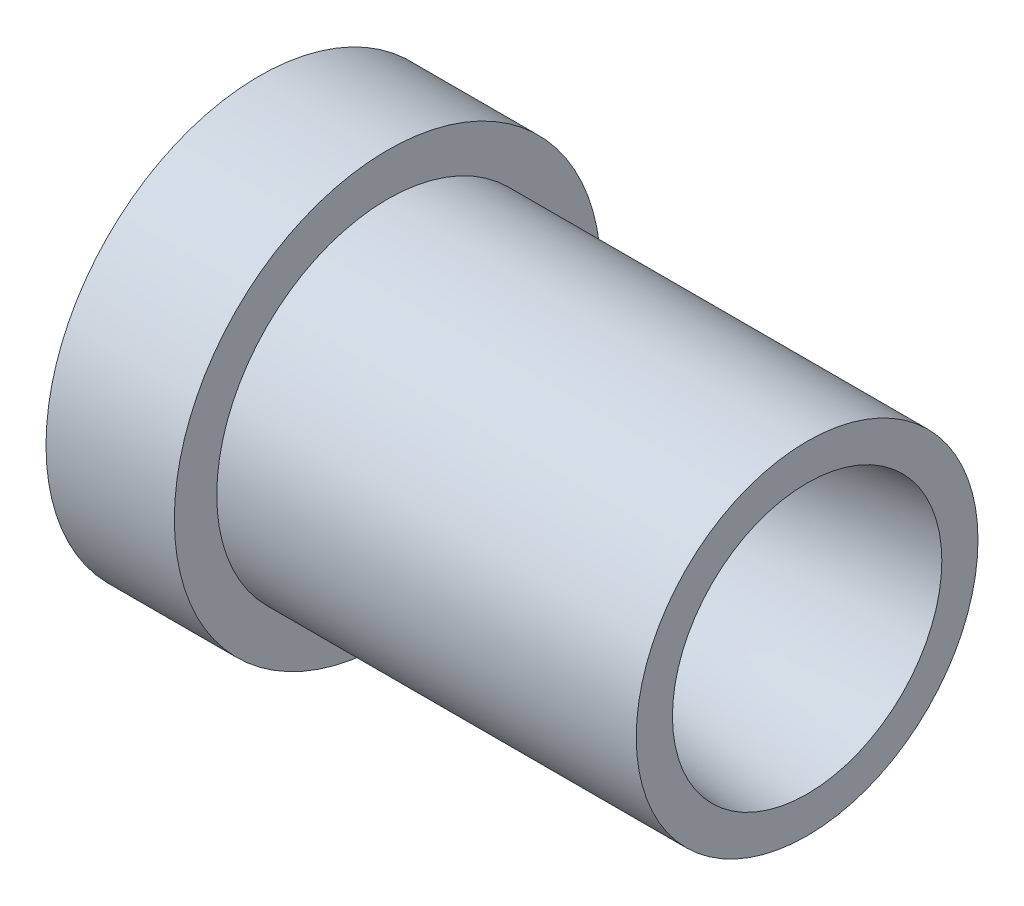
ISO-10303-21;
HEADER;
FILE_DESCRIPTION(('STEP AP214'),'2;1');
FILE_NAME('part.step','',(''),(''),'','','');
FILE_SCHEMA(('AUTOMOTIVE_DESIGN { 1 0 10303 214 1 1 1 1 }'));
ENDSEC;
DATA;
#1=APPLICATION_CONTEXT('core data for automotive mechanical design processes');
#2=APPLICATION_PROTOCOL_DEFINITION('international standard','automotive_design',2000,#1);
#3=PRODUCT_CONTEXT('',#1,'mechanical');
#4=PRODUCT('Part','Part','',(#3));
#5=PRODUCT_RELATED_PRODUCT_CATEGORY('part','',(#4));
#6=PRODUCT_DEFINITION_FORMATION('','',#4);
#7=PRODUCT_DEFINITION_CONTEXT('part definition',#1,'design');
#8=PRODUCT_DEFINITION('design','',#6,#7);
#9=PRODUCT_DEFINITION_SHAPE('','',#8);
#10=(LENGTH_UNIT() NAMED_UNIT(*) SI_UNIT(.MILLI.,.METRE.));
#11=(NAMED_UNIT(*) PLANE_ANGLE_UNIT() SI_UNIT($,.RADIAN.));
#12=(NAMED_UNIT(*) SI_UNIT($,.STERADIAN.) SOLID_ANGLE_UNIT());
#13=UNCERTAINTY_MEASURE_WITH_UNIT(LENGTH_MEASURE(1.E-05),#10,'distance_accuracy_value','');
#14=(GEOMETRIC_REPRESENTATION_CONTEXT(3) GLOBAL_UNCERTAINTY_ASSIGNED_CONTEXT((#13)) GLOBAL_UNIT_ASSIGNED_CONTEXT((#10,
#11,#12)) REPRESENTATION_CONTEXT('',''));
#15=CARTESIAN_POINT('',(0.,0.,0.));
#16=DIRECTION('',(0.,0.,1.));
#17=DIRECTION('',(1.,0.,0.));
#18=AXIS2_PLACEMENT_3D('',#15,#16,#17);
#19=CARTESIAN_POINT('',(-22.48672668,38.1,0.));
#20=CARTESIAN_POINT('',(-22.3703568606297,38.0989738804402,0.));
#21=CARTESIAN_POINT('',(-22.1376172124171,38.0969216412372,0.));
#22=CARTESIAN_POINT('',(-21.7888333901334,38.0803271114913,0.));
#23=CARTESIAN_POINT('',(-21.4407005679776,38.0538543434691,0.));
#24=CARTESIAN_POINT('',(-21.0935435028163,38.0165573884254,0.));
#25=CARTESIAN_POINT('',(-20.7476860196346,37.968731146902,0.));
#26=CARTESIAN_POINT('',(-20.4034507553943,37.9103504501566,0.));
#27=CARTESIAN_POINT('',(-20.0611587922825,37.8414885553896,0.));
#28=CARTESIAN_POINT('',(-19.7211294506775,37.7622046191633,0.));
#29=CARTESIAN_POINT('',(-19.3836799243135,37.6725739119584,0.));
#30=CARTESIAN_POINT('',(-19.0491249579279,37.5726797901868,0.));
#31=CARTESIAN_POINT('',(-18.7177766629177,37.4626154189392,0.));
#32=CARTESIAN_POINT('',(-18.389944097396,37.3424835338578,0.));
#33=CARTESIAN_POINT('',(-18.0659331066152,37.2123961116121,0.));
#34=CARTESIAN_POINT('',(-17.7460458927195,37.0724746074047,0.));
#35=CARTESIAN_POINT('',(-17.4305808832018,36.9228494462636,0.));
#36=CARTESIAN_POINT('',(-17.1198323401932,36.7636602542121,0.));
#37=CARTESIAN_POINT('',(-16.8140901276129,36.5950555029424,0.));
#38=CARTESIAN_POINT('',(-16.5136394586914,36.4171924772178,0.));
#39=CARTESIAN_POINT('',(-16.2187605971688,36.2302370838438,0.));
#40=CARTESIAN_POINT('',(-15.9297286061616,36.0343637423088,0.));
#41=CARTESIAN_POINT('',(-15.6468131039521,35.8297551522505,0.));
#42=CARTESIAN_POINT('',(-15.3702779958984,35.6166021714101,0.));
#43=CARTESIAN_POINT('',(-15.1003812654297,35.3951036061048,0.));
#44=CARTESIAN_POINT('',(-14.837374632063,35.165466125437,0.));
#45=CARTESIAN_POINT('',(-14.5815034288487,34.9279039483384,0.));
#46=CARTESIAN_POINT('',(-14.3330063880229,34.6826386156283,0.));
#47=CARTESIAN_POINT('',(-14.0921153053137,34.4298989357095,0.));
#48=CARTESIAN_POINT('',(-13.8590548334757,34.1699207198507,0.));
#49=CARTESIAN_POINT('',(-13.6340424559484,33.9029463990434,0.));
#50=CARTESIAN_POINT('',(-13.4172879832629,33.6292250954944,0.));
#51=CARTESIAN_POINT('',(-13.2089936749283,33.3490120658205,0.));
#52=CARTESIAN_POINT('',(-13.0093538193413,33.0625687401613,0.));
#53=CARTESIAN_POINT('',(-12.8185544865451,32.7701623392776,0.));
#54=CARTESIAN_POINT('',(-12.6367744203674,32.4720653821157,0.));
#55=CARTESIAN_POINT('',(-12.4641801400311,32.1685570489219,0.));
#56=CARTESIAN_POINT('',(-12.3009442113879,31.8599162065813,0.));
#57=CARTESIAN_POINT('',(-12.1471757820743,31.5464465787331,0.));
#58=CARTESIAN_POINT('',(-12.0031789377869,31.228381675372,0.));
#59=CARTESIAN_POINT('',(-11.8684887221122,30.9062378742272,0.));
#60=CARTESIAN_POINT('',(-11.7077285136921,30.4792628107288,0.));
#61=CARTESIAN_POINT('',(-11.5173268903181,29.9491478735473,0.));
#62=CARTESIAN_POINT('',(-11.2873301661826,29.3194663014734,0.));
#63=CARTESIAN_POINT('',(-11.0582433378532,28.6894580889853,0.));
#64=CARTESIAN_POINT('',(-10.8289126941384,28.0595373999227,0.));
#65=CARTESIAN_POINT('',(-10.5996473641844,27.4295932672447,0.));
#66=CARTESIAN_POINT('',(-10.3703645975399,26.7996553937677,0.));
#67=CARTESIAN_POINT('',(-10.1410864457192,26.169715855539,0.));
#68=CARTESIAN_POINT('',(-9.91180707858705,25.5397767587737,0.));
#69=CARTESIAN_POINT('',(-9.68252801204974,24.9098375573447,0.));
#70=CARTESIAN_POINT('',(-9.45324891515644,24.2798983665743,0.));
#71=CARTESIAN_POINT('',(-9.22396977465523,23.6499591915737,0.));
#72=CARTESIAN_POINT('',(-8.99469075235904,23.0200199712671,0.));
#73=CARTESIAN_POINT('',(-8.76541124889904,22.3900809260788,0.));
#74=CARTESIAN_POINT('',(-8.53613355486049,21.760141233887,0.));
#75=CARTESIAN_POINT('',(-8.30684928884343,21.130203890504,0.));
#76=CARTESIAN_POINT('',(-8.07758931677565,20.5002578629757,0.));
#77=CARTESIAN_POINT('',(-7.84823873791655,19.8703442150573,0.));
#78=CARTESIAN_POINT('',(-7.6192263414987,19.2403097157061,0.));
#79=CARTESIAN_POINT('',(-7.38895190050671,18.6107261916225,0.));
#80=CARTESIAN_POINT('',(-7.20377261832089,18.0924821003615,0.));
#81=CARTESIAN_POINT('',(-7.05072543770446,17.6902095457017,0.));
#82=CARTESIAN_POINT('',(-6.92650088473896,17.4057374572249,0.));
#83=CARTESIAN_POINT('',(-6.79137266879868,17.1263264991133,0.));
#84=CARTESIAN_POINT('',(-6.64482671252018,16.8527109365997,0.));
#85=CARTESIAN_POINT('',(-6.48730384389032,16.5852718824925,0.));
#86=CARTESIAN_POINT('',(-6.3190122137257,16.3244722908896,0.));
#87=CARTESIAN_POINT('',(-6.14024514580974,16.070739401084,0.));
#88=CARTESIAN_POINT('',(-5.95129521596674,15.8244953914115,0.));
#89=CARTESIAN_POINT('',(-5.7524768569501,15.5861481630461,0.));
#90=CARTESIAN_POINT('',(-5.54411937768967,15.3560931319468,0.));
#91=CARTESIAN_POINT('',(-5.3265684544617,15.1347116825487,0.));
#92=CARTESIAN_POINT('',(-5.10018479394783,14.9223709400505,0.));
#93=CARTESIAN_POINT('',(-4.86534372795271,14.7194231012118,0.));
#94=CARTESIAN_POINT('',(-4.62243480846053,14.5262045535991,0.));
#95=CARTESIAN_POINT('',(-4.37186070432891,14.34303584853,0.));
#96=CARTESIAN_POINT('',(-4.11403702547201,14.1702206076587,0.));
#97=CARTESIAN_POINT('',(-3.84939125435755,14.0080454879611,0.));
#98=CARTESIAN_POINT('',(-3.57836227950265,13.8567793567179,0.));
#99=CARTESIAN_POINT('',(-3.30139948749992,13.7166731098371,0.));
#100=CARTESIAN_POINT('',(-3.01896218712723,13.5879589943454,0.));
#101=CARTESIAN_POINT('',(-2.73151870053067,13.4708505177759,0.));
#102=CARTESIAN_POINT('',(-2.43954569987523,13.3655418332846,0.));
#103=CARTESIAN_POINT('',(-2.14352732343556,13.2722076072846,0.));
#104=CARTESIAN_POINT('',(-1.84395447010816,13.1910026677557,0.));
#105=CARTESIAN_POINT('',(-1.54132389582281,13.1220610946484,0.));
#106=CARTESIAN_POINT('',(-1.23613739211321,13.0654996532428,0.));
#107=CARTESIAN_POINT('',(-0.928901200258055,13.0214029900335,0.));
#108=CARTESIAN_POINT('',(-0.620124167869991,12.9898784065469,0.));
#109=CARTESIAN_POINT('',(-0.310320711258366,12.9708503684886,0.));
#110=CARTESIAN_POINT('',(-0.0206802830912623,12.9652290822455,0.));
#111=CARTESIAN_POINT('',(0.248254877558912,12.9687723057329,0.));
#112=CARTESIAN_POINT('',(0.49636324748549,12.9778063651822,0.));
#113=CARTESIAN_POINT('',(0.744174099380736,12.9929800908623,0.));
#114=CARTESIAN_POINT('',(0.991540862070323,13.0141827220314,0.));
#115=CARTESIAN_POINT('',(1.23831601316633,13.0414267148035,0.));
#116=CARTESIAN_POINT('',(1.48435023624933,13.0746969664341,0.));
#117=CARTESIAN_POINT('',(1.72950443411057,13.113944035334,0.));
#118=CARTESIAN_POINT('',(1.97360307228642,13.1592614477604,0.));
#119=CARTESIAN_POINT('',(2.21660932437942,13.2101839389857,0.));
#120=CARTESIAN_POINT('',(2.74110815480617,13.3365114159121,0.));
#121=CARTESIAN_POINT('',(3.54622514558586,13.5409174330162,0.));
#122=CARTESIAN_POINT('',(4.6351036791203,13.8108867764801,0.));
#123=CARTESIAN_POINT('',(5.72358261776982,14.0821604503519,0.));
#124=CARTESIAN_POINT('',(6.81216864343709,14.352667030535,0.));
#125=CARTESIAN_POINT('',(7.90072601835366,14.6228739128698,0.));
#126=CARTESIAN_POINT('',(8.98929110475462,14.8925684082065,0.));
#127=CARTESIAN_POINT('',(10.0778541834155,15.161719912803,0.));
#128=CARTESIAN_POINT('',(11.1664178740495,15.4302490947812,0.));
#129=CARTESIAN_POINT('',(12.2549814639299,15.6980897261768,0.));
#130=CARTESIAN_POINT('',(13.3435451587942,15.9651719801951,0.));
#131=CARTESIAN_POINT('',(14.4321089073372,16.2314270396581,0.));
#132=CARTESIAN_POINT('',(15.5206727288974,16.4967857895824,0.));
#133=CARTESIAN_POINT('',(16.6092366112144,16.7611792950852,0.));
#134=CARTESIAN_POINT('',(17.6978005928174,17.0245383866433,0.));
#135=CARTESIAN_POINT('',(18.7863646651581,17.2867941148534,0.));
#136=CARTESIAN_POINT('',(19.8749288331753,17.5478774221997,0.));
#137=CARTESIAN_POINT('',(20.9634931022686,17.8077192756134,0.));
#138=CARTESIAN_POINT('',(22.052057472974,18.0662506544953,0.));
#139=CARTESIAN_POINT('',(23.1406219574306,18.323402461863,0.));
#140=CARTESIAN_POINT('',(24.229186548404,18.5791057462132,0.));
#141=CARTESIAN_POINT('',(25.3177512748084,18.8332913836579,0.));
#142=CARTESIAN_POINT('',(26.4063161358706,19.0858904041606,0.));
#143=CARTESIAN_POINT('',(27.4948811245463,19.3368337854287,0.));
#144=CARTESIAN_POINT('',(28.5834462771015,19.5860523691771,0.));
#145=CARTESIAN_POINT('',(29.6720115528701,19.8334773085406,0.));
#146=CARTESIAN_POINT('',(30.7605769989974,20.0790393681446,0.));
#147=CARTESIAN_POINT('',(31.8491425855619,20.3226696852926,0.));
#148=CARTESIAN_POINT('',(32.937708360039,20.5642990580475,0.));
#149=CARTESIAN_POINT('',(34.0262743036505,20.8038585935332,0.));
#150=CARTESIAN_POINT('',(35.1148404334475,21.0412791791368,0.));
#151=CARTESIAN_POINT('',(36.2034067507808,21.276491793876,0.));
#152=CARTESIAN_POINT('',(37.2919732576195,21.509427415743,0.));
#153=CARTESIAN_POINT('',(38.3805399696244,21.7400169347885,0.));
#154=CARTESIAN_POINT('',(39.4691068725612,21.9681914460175,0.));
#155=CARTESIAN_POINT('',(40.5576739995894,22.1938817886247,0.));
#156=CARTESIAN_POINT('',(41.6462413621959,22.417018942889,0.));
#157=CARTESIAN_POINT('',(42.734808940116,22.6375339649519,0.));
#158=CARTESIAN_POINT('',(43.8233767608373,22.855357718,0.));
#159=CARTESIAN_POINT('',(44.9119448268786,23.0704211781044,0.));
#160=CARTESIAN_POINT('',(46.0005131281895,23.2826553532783,0.));
#161=CARTESIAN_POINT('',(47.0890816920929,23.4919911551921,0.));
#162=CARTESIAN_POINT('',(48.1776505152769,23.6983595931537,0.));
#163=CARTESIAN_POINT('',(49.2662196217735,23.9016915867973,0.));
#164=CARTESIAN_POINT('',(50.3547890069969,24.1019181083831,0.));
#165=CARTESIAN_POINT('',(51.443358679001,24.2989701170736,0.));
#166=CARTESIAN_POINT('',(52.5319286452958,24.4927785748154,0.));
#167=CARTESIAN_POINT('',(53.6204989047846,24.6832744447923,0.));
#168=CARTESIAN_POINT('',(54.7090694765989,24.8703886787375,0.));
#169=CARTESIAN_POINT('',(55.7976403542459,25.0540523059695,0.));
#170=CARTESIAN_POINT('',(56.8862115826166,25.2341961243305,0.));
#171=CARTESIAN_POINT('',(57.9747831312271,25.4107512648917,0.));
#172=CARTESIAN_POINT('',(59.063355022294,25.5836486110855,0.));
#173=CARTESIAN_POINT('',(60.1519272625028,25.7528191129924,0.));
#174=CARTESIAN_POINT('',(61.2404998572051,25.9181936983101,0.));
#175=CARTESIAN_POINT('',(62.3290728011985,26.0797034636213,0.));
#176=CARTESIAN_POINT('',(63.4176461318679,26.2372791785579,0.));
#177=CARTESIAN_POINT('',(64.506219844346,26.3908519376035,0.));
#178=CARTESIAN_POINT('',(65.5947939435335,26.5403526735836,0.));
#179=CARTESIAN_POINT('',(66.6833684406135,26.685712312991,0.));
#180=CARTESIAN_POINT('',(67.7719433414886,26.8268618193239,0.));
#181=CARTESIAN_POINT('',(68.8605186447429,26.9637321622321,0.));
#182=CARTESIAN_POINT('',(69.9490943724699,27.0962542469394,0.));
#183=CARTESIAN_POINT('',(71.0376705108964,27.2243592532375,0.));
#184=CARTESIAN_POINT('',(72.1262471407509,27.3479774195829,0.));
#185=CARTESIAN_POINT('',(73.2148240571817,27.4670420764602,0.));
#186=CARTESIAN_POINT('',(74.3034020021653,27.5814755594581,0.));
#187=CARTESIAN_POINT('',(75.3919782360985,27.6912410672113,0.));
#188=CARTESIAN_POINT('',(76.4805630354249,27.796148978952,0.));
#189=CARTESIAN_POINT('',(77.5691180744805,27.8965800526643,0.));
#190=CARTESIAN_POINT('',(78.2950388112846,27.9593975464753,0.));
#191=CARTESIAN_POINT('',(78.6579264532,27.9908,0.));
#192=B_SPLINE_CURVE_WITH_KNOTS('',3,(#19,#20,#21,#22,#23,#24,#25,#26,#27,#28,#29,#30,#31,#32,
#33,#34,#35,#36,#37,#38,#39,#40,#41,#42,#43,#44,#45,#46,#47,#48,#49,#50,#51,#52,#53,#54,#55,#56,
#57,#58,#59,#60,#61,#62,#63,#64,#65,#66,#67,#68,#69,#70,#71,#72,#73,#74,#75,#76,#77,#78,#79,#80,
#81,#82,#83,#84,#85,#86,#87,#88,#89,#90,#91,#92,#93,#94,#95,#96,#97,#98,#99,#100,#101,#102,#103,
#104,#105,#106,#107,#108,#109,#110,#111,#112,#113,#114,#115,#116,#117,#118,#119,#120,#121,#122,
#123,#124,#125,#126,#127,#128,#129,#130,#131,#132,#133,#134,#135,#136,#137,#138,#139,#140,#141,
#142,#143,#144,#145,#146,#147,#148,#149,#150,#151,#152,#153,#154,#155,#156,#157,#158,#159,#160,
#161,#162,#163,#164,#165,#166,#167,#168,#169,#170,#171,#172,#173,#174,#175,#176,#177,#178,#179,
#180,#181,#182,#183,#184,#185,#186,#187,#188,#189,#190,#191),.UNSPECIFIED.,.F.,.F.,(4,1,1,1,1,1,
1,1,1,1,1,1,1,1,1,1,1,1,1,1,1,1,1,1,1,1,1,1,1,1,1,1,1,1,1,1,1,1,1,1,1,1,1,1,1,1,1,1,1,1,1,1,1,1,
1,1,1,1,1,1,1,1,1,1,1,1,1,1,1,1,1,1,1,1,1,1,1,1,1,1,1,1,1,1,1,1,1,1,1,1,1,1,1,1,1,1,1,1,1,1,1,1,
1,1,1,1,1,1,1,1,1,1,1,1,1,1,1,1,1,1,1,1,1,1,1,1,1,1,1,1,1,1,1,1,1,1,1,1,1,1,1,1,1,1,1,1,1,1,1,1,
1,1,1,1,1,1,1,1,1,1,1,1,1,1,1,1,1,1,1,1,4),(0.,0.00298735070229633,0.00597470164775052,
0.00896205264266844,0.0119494035177719,0.0149367543554996,0.0179241053559431,0.0209114562428846,
0.02389880724207,0.0268861580942772,0.0298735088966282,0.0328608599121857,0.0358482108160948,
0.0388355616616236,0.0418229126462507,0.0448102634559478,0.0477976144402222,0.0507849652440486,
0.053772316300085,0.0567596671983812,0.05974701806846,0.0627343689663345,0.0657217198177719,
0.0687090707793906,0.0716964216926848,0.0746837726420623,0.077671123548564,0.0806584745248325,
0.0836458253820726,0.086633176154822,0.0896205271922522,0.0926078779123437,0.0955952288539019,
0.098582579857216,0.101569930861066,0.10455728172283,0.107544632522668,0.11053198348603,
0.113519334404318,0.116506685258125,0.119494036325395,0.125230632500157,0.130967228600579,
0.136703824979591,0.142440421154354,0.148177017329116,0.153913613633787,0.159650209808549,
0.165386806187561,0.171123402362324,0.176859998462746,0.182596594841757,0.18833319101652,
0.194069787191282,0.199806383495954,0.205542979670716,0.211279575845478,0.21701617222449,
0.222752768324912,0.228489364703924,0.234225960878686,0.236881303575514,0.239536646261257,
0.242191989145914,0.24484733177398,0.247502674550285,0.250158017313765,0.25281336016706,
0.255468702787415,0.258124045655976,0.260779388356698,0.263434731056448,0.266090073873425,
0.268745416566436,0.271400759272477,0.274056102027722,0.276711444948613,0.279366787702765,
0.282022130310635,0.284677472987951,0.287332815779983,0.289988158548348,0.292643501242421,
0.29529884406314,0.297954186758391,0.300609529528121,0.303264872322097,0.305920215063427,
0.30857555789559,0.311230900563436,0.313886243306907,0.316010611400598,0.318134979625916,
0.320259347790536,0.322383715931717,0.324508083975326,0.326632452127836,0.328756820448458,
0.330881188413485,0.33300555674549,0.335129924738794,0.344730434401771,0.354330517921702,
0.363930032849708,0.373528837251103,0.383126789598336,0.392723748872732,0.402319575302155,
0.411914129355432,0.421507272689336,0.431098867885369,0.440688778709728,0.450276870165411,
0.459863008436728,0.469447061633686,0.479028898937497,0.488608391345607,0.498185411617466,
0.507759834380589,0.517331536187031,0.526900395558805,0.536466293741691,0.546029113742119,
0.555588741132875,0.565145063902803,0.574697972905763,0.584247361437363,0.593793125663466,
0.603335165148155,0.61287338207191,0.622407681861293,0.631937973277447,0.641464168481753,
0.650986183104111,0.660503936324244,0.670017351522717,0.679526355388902,0.689030878883723,
0.698530856883131,0.708026228555726,0.71751693743432,0.72700293119498,0.736484162795522,
0.745960589149561,0.755432172222307,0.764898878895992,0.774360681090285,0.783817555883175,
0.793269485418097,0.802716457918726,0.812158466345724,0.821595509735054,0.831027592749108,
0.840454725944638,0.849876925928968,0.859294215297706,0.868706623394635,0.878114185464698,
0.887516943415647,0.89691494576229,0.906308247809874,0.915696911747891,0.925081006558344,
0.934460609028064,0.943835802476118,0.95320667789255,0.962573333766616,0.9719358761437,
0.981294418862628,0.990649083452993,1.),.UNSPECIFIED.);
#193=CARTESIAN_POINT('',(-35.18672668,0.,0.));
#194=DIRECTION('',(-1.,0.,0.));
#195=AXIS1_PLACEMENT('',#193,#194);
#196=SURFACE_OF_REVOLUTION('',#192,#195);
#197=CARTESIAN_POINT('',(78.6579264532,0.,0.));
#198=DIRECTION('',(-1.,0.,0.));
#199=DIRECTION('',(0.,0.,1.));
#200=AXIS2_PLACEMENT_3D('',#197,#198,#199);
#201=CIRCLE('',#200,27.9908);
#202=CARTESIAN_POINT('',(78.6579264532,0.,27.9908));
#203=VERTEX_POINT('',#202);
#204=EDGE_CURVE('E11',#203,#203,#201,.T.);
#205=ORIENTED_EDGE('',*,*,#204,.F.);
#206=EDGE_LOOP('',(#205));
#207=FACE_BOUND('',#206,.T.);
#208=CARTESIAN_POINT('',(-22.48672668,0.,0.));
#209=DIRECTION('',(-1.,0.,0.));
#210=DIRECTION('',(0.,0.,1.));
#211=AXIS2_PLACEMENT_3D('',#208,#209,#210);
#212=CIRCLE('',#211,38.1);
#213=CARTESIAN_POINT('',(-22.48672668,0.,38.1));
#214=VERTEX_POINT('',#213);
#215=EDGE_CURVE('E60',#214,#214,#212,.T.);
#216=ORIENTED_EDGE('',*,*,#215,.T.);
#217=EDGE_LOOP('',(#216));
#218=FACE_BOUND('',#217,.T.);
#219=ADVANCED_FACE('F34',(#207,#218),#196,.T.);
#220=CARTESIAN_POINT('',(78.6579264532,35.5092,0.));
#221=DIRECTION('',(-1.,0.,0.));
#222=DIRECTION('',(0.,0.,1.));
#223=AXIS2_PLACEMENT_3D('',#220,#221,#222);
#224=PLANE('',#223);
#225=CARTESIAN_POINT('',(78.6579264532,0.,0.));
#226=DIRECTION('',(-1.,0.,0.));
#227=DIRECTION('',(0.,0.,1.));
#228=AXIS2_PLACEMENT_3D('',#225,#226,#227);
#229=CIRCLE('',#228,35.5092);
#230=CARTESIAN_POINT('',(78.6579264532,0.,35.5092));
#231=VERTEX_POINT('',#230);
#232=EDGE_CURVE('E41',#231,#231,#229,.T.);
#233=ORIENTED_EDGE('',*,*,#232,.F.);
#234=EDGE_LOOP('',(#233));
#235=FACE_BOUND('',#234,.T.);
#236=ORIENTED_EDGE('',*,*,#204,.T.);
#237=EDGE_LOOP('',(#236));
#238=FACE_BOUND('',#237,.T.);
#239=ADVANCED_FACE('F97',(#235,#238),#224,.F.);
#240=CARTESIAN_POINT('',(-35.18672668,0.,0.));
#241=DIRECTION('',(-1.,0.,0.));
#242=DIRECTION('',(0.,0.,1.));
#243=AXIS2_PLACEMENT_3D('',#240,#241,#242);
#244=CYLINDRICAL_SURFACE('',#243,35.5092);
#245=CARTESIAN_POINT('',(-8.51672668,0.,0.));
#246=DIRECTION('',(-1.,0.,0.));
#247=DIRECTION('',(0.,0.,1.));
#248=AXIS2_PLACEMENT_3D('',#245,#246,#247);
#249=CIRCLE('',#248,35.5092);
#250=CARTESIAN_POINT('',(-8.51672668,0.,35.5092));
#251=VERTEX_POINT('',#250);
#252=EDGE_CURVE('E45',#251,#251,#249,.T.);
#253=ORIENTED_EDGE('',*,*,#252,.F.);
#254=EDGE_LOOP('',(#253));
#255=FACE_BOUND('',#254,.T.);
#256=ORIENTED_EDGE('',*,*,#232,.T.);
#257=EDGE_LOOP('',(#256));
#258=FACE_BOUND('',#257,.T.);
#259=ADVANCED_FACE('F92',(#255,#258),#244,.T.);
#260=CARTESIAN_POINT('',(-8.51672668,44.323,0.));
#261=DIRECTION('',(-1.,0.,0.));
#262=DIRECTION('',(0.,0.,1.));
#263=AXIS2_PLACEMENT_3D('',#260,#261,#262);
#264=PLANE('',#263);
#265=CARTESIAN_POINT('',(-8.51672668,0.,0.));
#266=DIRECTION('',(-1.,0.,0.));
#267=DIRECTION('',(0.,0.,1.));
#268=AXIS2_PLACEMENT_3D('',#265,#266,#267);
#269=CIRCLE('',#268,44.323);
#270=CARTESIAN_POINT('',(-8.51672668,0.,44.323));
#271=VERTEX_POINT('',#270);
#272=EDGE_CURVE('E49',#271,#271,#269,.T.);
#273=ORIENTED_EDGE('',*,*,#272,.F.);
#274=EDGE_LOOP('',(#273));
#275=FACE_BOUND('',#274,.T.);
#276=ORIENTED_EDGE('',*,*,#252,.T.);
#277=EDGE_LOOP('',(#276));
#278=FACE_BOUND('',#277,.T.);
#279=ADVANCED_FACE('F86',(#275,#278),#264,.F.);
#280=CARTESIAN_POINT('',(-35.18672668,0.,0.));
#281=DIRECTION('',(-1.,0.,0.));
#282=DIRECTION('',(0.,0.,1.));
#283=AXIS2_PLACEMENT_3D('',#280,#281,#282);
#284=CYLINDRICAL_SURFACE('',#283,44.323);
#285=CARTESIAN_POINT('',(-35.18672668,0.,0.));
#286=DIRECTION('',(-1.,0.,0.));
#287=DIRECTION('',(0.,0.,1.));
#288=AXIS2_PLACEMENT_3D('',#285,#286,#287);
#289=CIRCLE('',#288,44.323);
#290=CARTESIAN_POINT('',(-35.18672668,0.,44.323));
#291=VERTEX_POINT('',#290);
#292=EDGE_CURVE('E54',#291,#291,#289,.T.);
#293=ORIENTED_EDGE('',*,*,#292,.F.);
#294=EDGE_LOOP('',(#293));
#295=FACE_BOUND('',#294,.T.);
#296=ORIENTED_EDGE('',*,*,#272,.T.);
#297=EDGE_LOOP('',(#296));
#298=FACE_BOUND('',#297,.T.);
#299=ADVANCED_FACE('F80',(#295,#298),#284,.T.);
#300=CARTESIAN_POINT('',(-35.18672668,38.1,0.));
#301=DIRECTION('',(1.,0.,0.));
#302=DIRECTION('',(0.,0.,-1.));
#303=AXIS2_PLACEMENT_3D('',#300,#301,#302);
#304=PLANE('',#303);
#305=CARTESIAN_POINT('',(-35.18672668,0.,0.));
#306=DIRECTION('',(-1.,0.,0.));
#307=DIRECTION('',(0.,0.,1.));
#308=AXIS2_PLACEMENT_3D('',#305,#306,#307);
#309=CIRCLE('',#308,38.1);
#310=CARTESIAN_POINT('',(-35.18672668,0.,38.1));
#311=VERTEX_POINT('',#310);
#312=EDGE_CURVE('E57',#311,#311,#309,.T.);
#313=ORIENTED_EDGE('',*,*,#312,.F.);
#314=EDGE_LOOP('',(#313));
#315=FACE_BOUND('',#314,.T.);
#316=ORIENTED_EDGE('',*,*,#292,.T.);
#317=EDGE_LOOP('',(#316));
#318=FACE_BOUND('',#317,.T.);
#319=ADVANCED_FACE('F74',(#315,#318),#304,.F.);
#320=CARTESIAN_POINT('',(-35.18672668,0.,0.));
#321=DIRECTION('',(-1.,0.,0.));
#322=DIRECTION('',(0.,0.,1.));
#323=AXIS2_PLACEMENT_3D('',#320,#321,#322);
#324=CYLINDRICAL_SURFACE('',#323,38.1);
#325=ORIENTED_EDGE('',*,*,#215,.F.);
#326=EDGE_LOOP('',(#325));
#327=FACE_BOUND('',#326,.T.);
#328=ORIENTED_EDGE('',*,*,#312,.T.);
#329=EDGE_LOOP('',(#328));
#330=FACE_BOUND('',#329,.T.);
#331=ADVANCED_FACE('F71',(#327,#330),#324,.F.);
#332=CLOSED_SHELL('',(#219,#239,#259,#279,#299,#319,#331));
#333=MANIFOLD_SOLID_BREP('B2',#332);
#334=ADVANCED_BREP_SHAPE_REPRESENTATION('',(#18,#333),#14);
#335=SHAPE_DEFINITION_REPRESENTATION(#9,#334);
ENDSEC;
END-ISO-10303-21;
